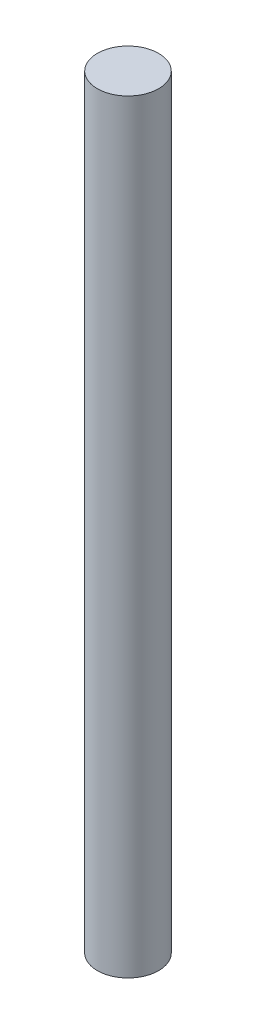
ISO-10303-21;
HEADER;
FILE_DESCRIPTION(('STEP AP214'),'2;1');
FILE_NAME('part.step','',(''),(''),'','','');
FILE_SCHEMA(('AUTOMOTIVE_DESIGN { 1 0 10303 214 1 1 1 1 }'));
ENDSEC;
DATA;
#1=APPLICATION_CONTEXT('core data for automotive mechanical design processes');
#2=APPLICATION_PROTOCOL_DEFINITION('international standard','automotive_design',2000,#1);
#3=PRODUCT_CONTEXT('',#1,'mechanical');
#4=PRODUCT('Part','Part','',(#3));
#5=PRODUCT_RELATED_PRODUCT_CATEGORY('part','',(#4));
#6=PRODUCT_DEFINITION_FORMATION('','',#4);
#7=PRODUCT_DEFINITION_CONTEXT('part definition',#1,'design');
#8=PRODUCT_DEFINITION('design','',#6,#7);
#9=PRODUCT_DEFINITION_SHAPE('','',#8);
#10=(LENGTH_UNIT() NAMED_UNIT(*) SI_UNIT(.MILLI.,.METRE.));
#11=(NAMED_UNIT(*) PLANE_ANGLE_UNIT() SI_UNIT($,.RADIAN.));
#12=(NAMED_UNIT(*) SI_UNIT($,.STERADIAN.) SOLID_ANGLE_UNIT());
#13=UNCERTAINTY_MEASURE_WITH_UNIT(LENGTH_MEASURE(1.E-05),#10,'distance_accuracy_value','');
#14=(GEOMETRIC_REPRESENTATION_CONTEXT(3) GLOBAL_UNCERTAINTY_ASSIGNED_CONTEXT((#13)) GLOBAL_UNIT_ASSIGNED_CONTEXT((#10,
#11,#12)) REPRESENTATION_CONTEXT('',''));
#15=CARTESIAN_POINT('',(0.,0.,0.));
#16=DIRECTION('',(0.,0.,1.));
#17=DIRECTION('',(1.,0.,0.));
#18=AXIS2_PLACEMENT_3D('',#15,#16,#17);
#19=CARTESIAN_POINT('',(0.,49.5,0.));
#20=DIRECTION('',(0.,-1.,0.));
#21=DIRECTION('',(0.,0.,-1.));
#22=AXIS2_PLACEMENT_3D('',#19,#20,#21);
#23=CYLINDRICAL_SURFACE('',#22,1.985);
#24=CARTESIAN_POINT('',(0.,49.5,0.));
#25=DIRECTION('',(0.,1.,0.));
#26=DIRECTION('',(0.,0.,1.));
#27=AXIS2_PLACEMENT_3D('',#24,#25,#26);
#28=CIRCLE('',#27,1.985);
#29=CARTESIAN_POINT('',(0.,49.5,1.985));
#30=VERTEX_POINT('',#29);
#31=EDGE_CURVE('E10',#30,#30,#28,.T.);
#32=ORIENTED_EDGE('',*,*,#31,.F.);
#33=EDGE_LOOP('',(#32));
#34=FACE_BOUND('',#33,.T.);
#35=CARTESIAN_POINT('',(0.,0.,0.));
#36=DIRECTION('',(0.,1.,0.));
#37=DIRECTION('',(0.,0.,1.));
#38=AXIS2_PLACEMENT_3D('',#35,#36,#37);
#39=CIRCLE('',#38,1.985);
#40=CARTESIAN_POINT('',(0.,0.,1.985));
#41=VERTEX_POINT('',#40);
#42=EDGE_CURVE('E46',#41,#41,#39,.T.);
#43=ORIENTED_EDGE('',*,*,#42,.T.);
#44=EDGE_LOOP('',(#43));
#45=FACE_BOUND('',#44,.T.);
#46=ADVANCED_FACE('F43',(#34,#45),#23,.T.);
#47=CARTESIAN_POINT('',(0.,49.5,0.));
#48=DIRECTION('',(0.,1.,0.));
#49=DIRECTION('',(0.,0.,1.));
#50=AXIS2_PLACEMENT_3D('',#47,#48,#49);
#51=PLANE('',#50);
#52=ORIENTED_EDGE('',*,*,#31,.T.);
#53=EDGE_LOOP('',(#52));
#54=FACE_BOUND('',#53,.T.);
#55=ADVANCED_FACE('F60',(#54),#51,.T.);
#56=CARTESIAN_POINT('',(0.,0.,0.));
#57=DIRECTION('',(0.,1.,0.));
#58=DIRECTION('',(0.,0.,1.));
#59=AXIS2_PLACEMENT_3D('',#56,#57,#58);
#60=PLANE('',#59);
#61=ORIENTED_EDGE('',*,*,#42,.F.);
#62=EDGE_LOOP('',(#61));
#63=FACE_BOUND('',#62,.T.);
#64=ADVANCED_FACE('F58',(#63),#60,.F.);
#65=CLOSED_SHELL('',(#46,#55,#64));
#66=MANIFOLD_SOLID_BREP('B2',#65);
#67=ADVANCED_BREP_SHAPE_REPRESENTATION('',(#18,#66),#14);
#68=SHAPE_DEFINITION_REPRESENTATION(#9,#67);
ENDSEC;
END-ISO-10303-21;
